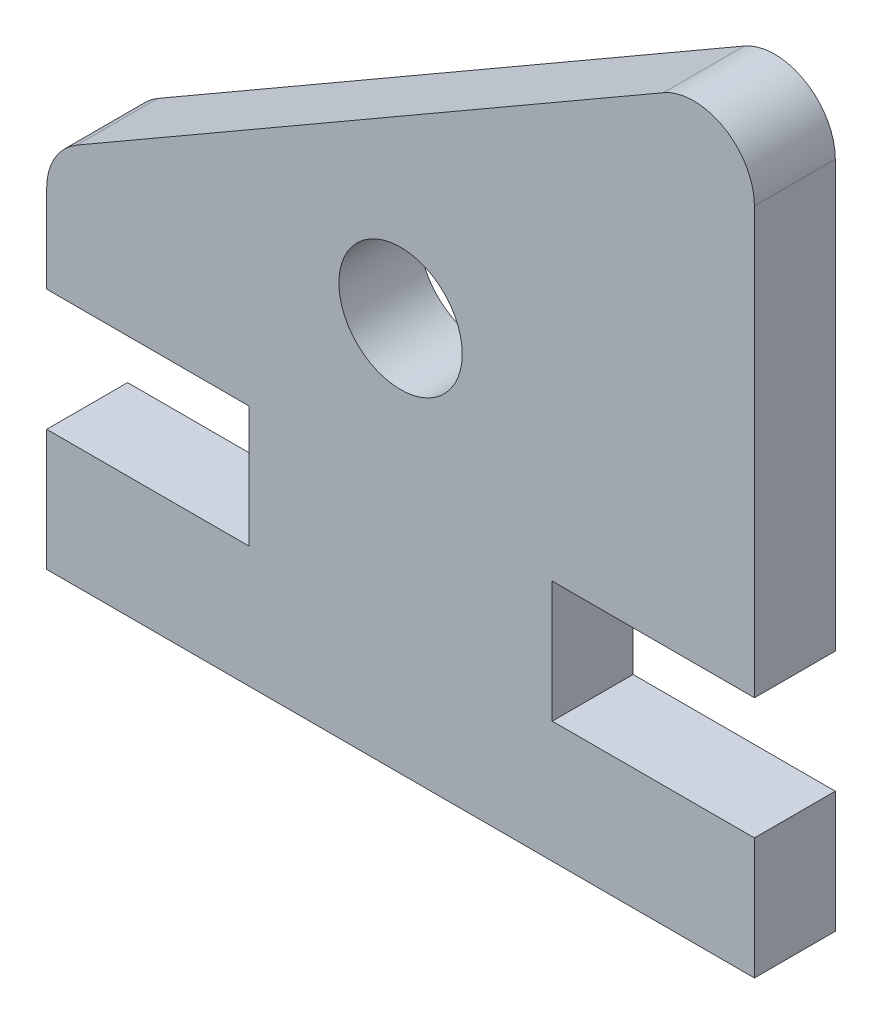
ISO-10303-21;
HEADER;
FILE_DESCRIPTION(('STEP AP214'),'2;1');
FILE_NAME('part.step','',(''),(''),'','','');
FILE_SCHEMA(('AUTOMOTIVE_DESIGN { 1 0 10303 214 1 1 1 1 }'));
ENDSEC;
DATA;
#1=APPLICATION_CONTEXT('core data for automotive mechanical design processes');
#2=APPLICATION_PROTOCOL_DEFINITION('international standard','automotive_design',2000,#1);
#3=PRODUCT_CONTEXT('',#1,'mechanical');
#4=PRODUCT('Part','Part','',(#3));
#5=PRODUCT_RELATED_PRODUCT_CATEGORY('part','',(#4));
#6=PRODUCT_DEFINITION_FORMATION('','',#4);
#7=PRODUCT_DEFINITION_CONTEXT('part definition',#1,'design');
#8=PRODUCT_DEFINITION('design','',#6,#7);
#9=PRODUCT_DEFINITION_SHAPE('','',#8);
#10=(LENGTH_UNIT() NAMED_UNIT(*) SI_UNIT(.MILLI.,.METRE.));
#11=(NAMED_UNIT(*) PLANE_ANGLE_UNIT() SI_UNIT($,.RADIAN.));
#12=(NAMED_UNIT(*) SI_UNIT($,.STERADIAN.) SOLID_ANGLE_UNIT());
#13=UNCERTAINTY_MEASURE_WITH_UNIT(LENGTH_MEASURE(1.E-05),#10,'distance_accuracy_value','');
#14=(GEOMETRIC_REPRESENTATION_CONTEXT(3) GLOBAL_UNCERTAINTY_ASSIGNED_CONTEXT((#13)) GLOBAL_UNIT_ASSIGNED_CONTEXT((#10,
#11,#12)) REPRESENTATION_CONTEXT('',''));
#15=CARTESIAN_POINT('',(0.,0.,0.));
#16=DIRECTION('',(0.,0.,1.));
#17=DIRECTION('',(1.,0.,0.));
#18=AXIS2_PLACEMENT_3D('',#15,#16,#17);
#19=CARTESIAN_POINT('',(0.,6.,4.));
#20=DIRECTION('',(0.,-1.,0.));
#21=DIRECTION('',(1.,0.,0.));
#22=AXIS2_PLACEMENT_3D('',#19,#20,#21);
#23=PLANE('',#22);
#24=DIRECTION('',(-1.,0.,0.));
#25=VECTOR('',#24,1.);
#26=CARTESIAN_POINT('',(0.,6.,0.));
#27=LINE('',#26,#25);
#28=CARTESIAN_POINT('',(0.,6.,0.));
#29=VERTEX_POINT('',#28);
#30=CARTESIAN_POINT('',(-10.,6.,0.));
#31=VERTEX_POINT('',#30);
#32=EDGE_CURVE('E161',#29,#31,#27,.T.);
#33=ORIENTED_EDGE('',*,*,#32,.T.);
#34=DIRECTION('',(0.,0.,-1.));
#35=VECTOR('',#34,1.);
#36=CARTESIAN_POINT('',(-10.,6.,4.));
#37=LINE('',#36,#35);
#38=CARTESIAN_POINT('',(-10.,6.,4.));
#39=VERTEX_POINT('',#38);
#40=EDGE_CURVE('E143',#39,#31,#37,.T.);
#41=ORIENTED_EDGE('',*,*,#40,.F.);
#42=DIRECTION('',(-1.,0.,0.));
#43=VECTOR('',#42,1.);
#44=CARTESIAN_POINT('',(0.,6.,4.));
#45=LINE('',#44,#43);
#46=CARTESIAN_POINT('',(0.,6.,4.));
#47=VERTEX_POINT('',#46);
#48=EDGE_CURVE('E149',#47,#39,#45,.T.);
#49=ORIENTED_EDGE('',*,*,#48,.F.);
#50=DIRECTION('',(0.,0.,-1.));
#51=VECTOR('',#50,1.);
#52=CARTESIAN_POINT('',(0.,6.,4.));
#53=LINE('',#52,#51);
#54=EDGE_CURVE('E228',#47,#29,#53,.T.);
#55=ORIENTED_EDGE('',*,*,#54,.T.);
#56=EDGE_LOOP('',(#33,#41,#49,#55));
#57=FACE_BOUND('',#56,.T.);
#58=ADVANCED_FACE('F37',(#57),#23,.F.);
#59=CARTESIAN_POINT('',(-10.,0.,4.));
#60=DIRECTION('',(-1.,0.,0.));
#61=DIRECTION('',(0.,0.,1.));
#62=AXIS2_PLACEMENT_3D('',#59,#60,#61);
#63=PLANE('',#62);
#64=DIRECTION('',(0.,1.,0.));
#65=VECTOR('',#64,1.);
#66=CARTESIAN_POINT('',(-10.,0.,0.));
#67=LINE('',#66,#65);
#68=CARTESIAN_POINT('',(-10.,12.,0.));
#69=VERTEX_POINT('',#68);
#70=EDGE_CURVE('E248',#31,#69,#67,.T.);
#71=ORIENTED_EDGE('',*,*,#70,.T.);
#72=DIRECTION('',(0.,0.,-1.));
#73=VECTOR('',#72,1.);
#74=CARTESIAN_POINT('',(-10.,12.,4.));
#75=LINE('',#74,#73);
#76=CARTESIAN_POINT('',(-10.,12.,4.));
#77=VERTEX_POINT('',#76);
#78=EDGE_CURVE('E145',#77,#69,#75,.T.);
#79=ORIENTED_EDGE('',*,*,#78,.F.);
#80=DIRECTION('',(0.,1.,0.));
#81=VECTOR('',#80,1.);
#82=CARTESIAN_POINT('',(-10.,0.,4.));
#83=LINE('',#82,#81);
#84=EDGE_CURVE('E138',#39,#77,#83,.T.);
#85=ORIENTED_EDGE('',*,*,#84,.F.);
#86=ORIENTED_EDGE('',*,*,#40,.T.);
#87=EDGE_LOOP('',(#71,#79,#85,#86));
#88=FACE_BOUND('',#87,.T.);
#89=ADVANCED_FACE('F141',(#88),#63,.F.);
#90=CARTESIAN_POINT('',(0.,12.,4.));
#91=DIRECTION('',(0.,-1.,0.));
#92=DIRECTION('',(0.,0.,-1.));
#93=AXIS2_PLACEMENT_3D('',#90,#91,#92);
#94=PLANE('',#93);
#95=DIRECTION('',(-1.,0.,0.));
#96=VECTOR('',#95,1.);
#97=CARTESIAN_POINT('',(0.,12.,0.));
#98=LINE('',#97,#96);
#99=CARTESIAN_POINT('',(0.,12.,0.));
#100=VERTEX_POINT('',#99);
#101=EDGE_CURVE('E213',#100,#69,#98,.T.);
#102=ORIENTED_EDGE('',*,*,#101,.F.);
#103=DIRECTION('',(0.,0.,-1.));
#104=VECTOR('',#103,1.);
#105=CARTESIAN_POINT('',(0.,12.,4.));
#106=LINE('',#105,#104);
#107=CARTESIAN_POINT('',(0.,12.,4.));
#108=VERTEX_POINT('',#107);
#109=EDGE_CURVE('E167',#108,#100,#106,.T.);
#110=ORIENTED_EDGE('',*,*,#109,.F.);
#111=DIRECTION('',(-1.,0.,0.));
#112=VECTOR('',#111,1.);
#113=CARTESIAN_POINT('',(0.,12.,4.));
#114=LINE('',#113,#112);
#115=EDGE_CURVE('E148',#108,#77,#114,.T.);
#116=ORIENTED_EDGE('',*,*,#115,.T.);
#117=ORIENTED_EDGE('',*,*,#78,.T.);
#118=EDGE_LOOP('',(#102,#110,#116,#117));
#119=FACE_BOUND('',#118,.T.);
#120=ADVANCED_FACE('F247',(#119),#94,.T.);
#121=CARTESIAN_POINT('',(0.,0.,4.));
#122=DIRECTION('',(1.,0.,0.));
#123=DIRECTION('',(0.,1.,0.));
#124=AXIS2_PLACEMENT_3D('',#121,#122,#123);
#125=PLANE('',#124);
#126=DIRECTION('',(0.,-1.,0.));
#127=VECTOR('',#126,1.);
#128=CARTESIAN_POINT('',(0.,0.,0.));
#129=LINE('',#128,#127);
#130=CARTESIAN_POINT('',(0.,33.0677313259561,0.));
#131=VERTEX_POINT('',#130);
#132=EDGE_CURVE('E208',#131,#100,#129,.T.);
#133=ORIENTED_EDGE('',*,*,#132,.F.);
#134=DIRECTION('',(0.,0.,-1.));
#135=VECTOR('',#134,1.);
#136=CARTESIAN_POINT('',(0.,33.0677313259561,4.));
#137=LINE('',#136,#135);
#138=CARTESIAN_POINT('',(0.,33.0677313259561,4.));
#139=VERTEX_POINT('',#138);
#140=EDGE_CURVE('E11',#131,#139,#137,.F.);
#141=ORIENTED_EDGE('',*,*,#140,.T.);
#142=DIRECTION('',(0.,-1.,0.));
#143=VECTOR('',#142,1.);
#144=CARTESIAN_POINT('',(0.,0.,4.));
#145=LINE('',#144,#143);
#146=EDGE_CURVE('E244',#139,#108,#145,.T.);
#147=ORIENTED_EDGE('',*,*,#146,.T.);
#148=ORIENTED_EDGE('',*,*,#109,.T.);
#149=EDGE_LOOP('',(#133,#141,#147,#148));
#150=FACE_BOUND('',#149,.T.);
#151=ADVANCED_FACE('F243',(#150),#125,.T.);
#152=CARTESIAN_POINT('',(-16.5687476868981,28.6979128114972,4.));
#153=DIRECTION('',(-0.499999999999995,0.866025403784441,0.));
#154=DIRECTION('',(-0.866025403784442,-0.499999999999995,0.));
#155=AXIS2_PLACEMENT_3D('',#152,#153,#154);
#156=PLANE('',#155);
#157=DIRECTION('',(0.866025403784442,0.499999999999995,0.));
#158=VECTOR('',#157,1.);
#159=CARTESIAN_POINT('',(-16.5687476868981,28.6979128114972,0.));
#160=LINE('',#159,#158);
#161=CARTESIAN_POINT('',(-33.5,18.9226497308105,0.));
#162=VERTEX_POINT('',#161);
#163=CARTESIAN_POINT('',(-4.49999999999999,35.6658075373094,0.));
#164=VERTEX_POINT('',#163);
#165=EDGE_CURVE('E202',#162,#164,#160,.T.);
#166=ORIENTED_EDGE('',*,*,#165,.F.);
#167=DIRECTION('',(0.,0.,-1.));
#168=VECTOR('',#167,1.);
#169=CARTESIAN_POINT('',(-33.5,18.9226497308105,4.));
#170=LINE('',#169,#168);
#171=CARTESIAN_POINT('',(-33.5,18.9226497308105,4.));
#172=VERTEX_POINT('',#171);
#173=EDGE_CURVE('E177',#162,#172,#170,.F.);
#174=ORIENTED_EDGE('',*,*,#173,.T.);
#175=DIRECTION('',(0.866025403784442,0.499999999999995,0.));
#176=VECTOR('',#175,1.);
#177=CARTESIAN_POINT('',(-16.5687476868981,28.6979128114972,4.));
#178=LINE('',#177,#176);
#179=CARTESIAN_POINT('',(-4.49999999999999,35.6658075373094,4.));
#180=VERTEX_POINT('',#179);
#181=EDGE_CURVE('E185',#172,#180,#178,.T.);
#182=ORIENTED_EDGE('',*,*,#181,.T.);
#183=DIRECTION('',(0.,0.,-1.));
#184=VECTOR('',#183,1.);
#185=CARTESIAN_POINT('',(-4.49999999999999,35.6658075373094,4.));
#186=LINE('',#185,#184);
#187=EDGE_CURVE('E174',#180,#164,#186,.T.);
#188=ORIENTED_EDGE('',*,*,#187,.T.);
#189=EDGE_LOOP('',(#166,#174,#182,#188));
#190=FACE_BOUND('',#189,.T.);
#191=ADVANCED_FACE('F206',(#190),#156,.T.);
#192=CARTESIAN_POINT('',(-35.,0.,4.));
#193=DIRECTION('',(-1.,0.,0.));
#194=DIRECTION('',(0.,0.,1.));
#195=AXIS2_PLACEMENT_3D('',#192,#193,#194);
#196=PLANE('',#195);
#197=DIRECTION('',(0.,1.,0.));
#198=VECTOR('',#197,1.);
#199=CARTESIAN_POINT('',(-35.,0.,4.));
#200=LINE('',#199,#198);
#201=CARTESIAN_POINT('',(-35.,12.,4.));
#202=VERTEX_POINT('',#201);
#203=CARTESIAN_POINT('',(-35.,16.3245735194572,4.));
#204=VERTEX_POINT('',#203);
#205=EDGE_CURVE('E183',#202,#204,#200,.T.);
#206=ORIENTED_EDGE('',*,*,#205,.T.);
#207=DIRECTION('',(0.,0.,-1.));
#208=VECTOR('',#207,1.);
#209=CARTESIAN_POINT('',(-35.,16.3245735194572,4.));
#210=LINE('',#209,#208);
#211=CARTESIAN_POINT('',(-35.,16.3245735194572,0.));
#212=VERTEX_POINT('',#211);
#213=EDGE_CURVE('E162',#204,#212,#210,.T.);
#214=ORIENTED_EDGE('',*,*,#213,.T.);
#215=DIRECTION('',(0.,1.,0.));
#216=VECTOR('',#215,1.);
#217=CARTESIAN_POINT('',(-35.,0.,0.));
#218=LINE('',#217,#216);
#219=CARTESIAN_POINT('',(-35.,12.,0.));
#220=VERTEX_POINT('',#219);
#221=EDGE_CURVE('E204',#220,#212,#218,.T.);
#222=ORIENTED_EDGE('',*,*,#221,.F.);
#223=DIRECTION('',(0.,0.,-1.));
#224=VECTOR('',#223,1.);
#225=CARTESIAN_POINT('',(-35.,12.,4.));
#226=LINE('',#225,#224);
#227=EDGE_CURVE('E193',#202,#220,#226,.T.);
#228=ORIENTED_EDGE('',*,*,#227,.F.);
#229=EDGE_LOOP('',(#206,#214,#222,#228));
#230=FACE_BOUND('',#229,.T.);
#231=ADVANCED_FACE('F190',(#230),#196,.T.);
#232=CARTESIAN_POINT('',(0.,12.,4.));
#233=DIRECTION('',(0.,-1.,0.));
#234=DIRECTION('',(0.,0.,-1.));
#235=AXIS2_PLACEMENT_3D('',#232,#233,#234);
#236=PLANE('',#235);
#237=DIRECTION('',(-1.,0.,0.));
#238=VECTOR('',#237,1.);
#239=CARTESIAN_POINT('',(0.,12.,0.));
#240=LINE('',#239,#238);
#241=CARTESIAN_POINT('',(-25.,12.,0.));
#242=VERTEX_POINT('',#241);
#243=EDGE_CURVE('E210',#242,#220,#240,.T.);
#244=ORIENTED_EDGE('',*,*,#243,.F.);
#245=DIRECTION('',(0.,0.,-1.));
#246=VECTOR('',#245,1.);
#247=CARTESIAN_POINT('',(-25.,12.,4.));
#248=LINE('',#247,#246);
#249=CARTESIAN_POINT('',(-25.,12.,4.));
#250=VERTEX_POINT('',#249);
#251=EDGE_CURVE('E238',#250,#242,#248,.T.);
#252=ORIENTED_EDGE('',*,*,#251,.F.);
#253=DIRECTION('',(-1.,0.,0.));
#254=VECTOR('',#253,1.);
#255=CARTESIAN_POINT('',(0.,12.,4.));
#256=LINE('',#255,#254);
#257=EDGE_CURVE('E194',#250,#202,#256,.T.);
#258=ORIENTED_EDGE('',*,*,#257,.T.);
#259=ORIENTED_EDGE('',*,*,#227,.T.);
#260=EDGE_LOOP('',(#244,#252,#258,#259));
#261=FACE_BOUND('',#260,.T.);
#262=ADVANCED_FACE('F293',(#261),#236,.T.);
#263=CARTESIAN_POINT('',(-25.,0.,4.));
#264=DIRECTION('',(-1.,0.,0.));
#265=DIRECTION('',(0.,0.,1.));
#266=AXIS2_PLACEMENT_3D('',#263,#264,#265);
#267=PLANE('',#266);
#268=DIRECTION('',(0.,1.,0.));
#269=VECTOR('',#268,1.);
#270=CARTESIAN_POINT('',(-25.,0.,0.));
#271=LINE('',#270,#269);
#272=CARTESIAN_POINT('',(-25.,6.,0.));
#273=VERTEX_POINT('',#272);
#274=EDGE_CURVE('E219',#273,#242,#271,.T.);
#275=ORIENTED_EDGE('',*,*,#274,.F.);
#276=DIRECTION('',(0.,0.,-1.));
#277=VECTOR('',#276,1.);
#278=CARTESIAN_POINT('',(-25.,6.,4.));
#279=LINE('',#278,#277);
#280=CARTESIAN_POINT('',(-25.,6.,4.));
#281=VERTEX_POINT('',#280);
#282=EDGE_CURVE('E236',#281,#273,#279,.T.);
#283=ORIENTED_EDGE('',*,*,#282,.F.);
#284=DIRECTION('',(0.,1.,0.));
#285=VECTOR('',#284,1.);
#286=CARTESIAN_POINT('',(-25.,0.,4.));
#287=LINE('',#286,#285);
#288=EDGE_CURVE('E260',#281,#250,#287,.T.);
#289=ORIENTED_EDGE('',*,*,#288,.T.);
#290=ORIENTED_EDGE('',*,*,#251,.T.);
#291=EDGE_LOOP('',(#275,#283,#289,#290));
#292=FACE_BOUND('',#291,.T.);
#293=ADVANCED_FACE('F288',(#292),#267,.T.);
#294=CARTESIAN_POINT('',(0.,6.00000000000001,4.));
#295=DIRECTION('',(0.,-1.,0.));
#296=DIRECTION('',(1.,0.,0.));
#297=AXIS2_PLACEMENT_3D('',#294,#295,#296);
#298=PLANE('',#297);
#299=DIRECTION('',(-1.,0.,0.));
#300=VECTOR('',#299,1.);
#301=CARTESIAN_POINT('',(0.,6.00000000000001,0.));
#302=LINE('',#301,#300);
#303=CARTESIAN_POINT('',(-35.,6.,0.));
#304=VERTEX_POINT('',#303);
#305=EDGE_CURVE('E222',#273,#304,#302,.T.);
#306=ORIENTED_EDGE('',*,*,#305,.T.);
#307=DIRECTION('',(0.,0.,-1.));
#308=VECTOR('',#307,1.);
#309=CARTESIAN_POINT('',(-35.,6.,4.));
#310=LINE('',#309,#308);
#311=CARTESIAN_POINT('',(-35.,6.,4.));
#312=VERTEX_POINT('',#311);
#313=EDGE_CURVE('E234',#312,#304,#310,.T.);
#314=ORIENTED_EDGE('',*,*,#313,.F.);
#315=DIRECTION('',(-1.,0.,0.));
#316=VECTOR('',#315,1.);
#317=CARTESIAN_POINT('',(0.,6.00000000000001,4.));
#318=LINE('',#317,#316);
#319=EDGE_CURVE('E258',#281,#312,#318,.T.);
#320=ORIENTED_EDGE('',*,*,#319,.F.);
#321=ORIENTED_EDGE('',*,*,#282,.T.);
#322=EDGE_LOOP('',(#306,#314,#320,#321));
#323=FACE_BOUND('',#322,.T.);
#324=ADVANCED_FACE('F294',(#323),#298,.F.);
#325=CARTESIAN_POINT('',(-35.,0.,0.));
#326=VERTEX_POINT('',#325);
#327=EDGE_CURVE('E212',#326,#304,#218,.T.);
#328=ORIENTED_EDGE('',*,*,#327,.F.);
#329=DIRECTION('',(0.,0.,-1.));
#330=VECTOR('',#329,1.);
#331=CARTESIAN_POINT('',(-35.,0.,4.));
#332=LINE('',#331,#330);
#333=CARTESIAN_POINT('',(-35.,0.,4.));
#334=VERTEX_POINT('',#333);
#335=EDGE_CURVE('E232',#334,#326,#332,.T.);
#336=ORIENTED_EDGE('',*,*,#335,.F.);
#337=EDGE_CURVE('E196',#334,#312,#200,.T.);
#338=ORIENTED_EDGE('',*,*,#337,.T.);
#339=ORIENTED_EDGE('',*,*,#313,.T.);
#340=EDGE_LOOP('',(#328,#336,#338,#339));
#341=FACE_BOUND('',#340,.T.);
#342=ADVANCED_FACE('F282',(#341),#196,.T.);
#343=CARTESIAN_POINT('',(0.,0.,4.));
#344=DIRECTION('',(0.,-1.,0.));
#345=DIRECTION('',(1.,0.,0.));
#346=AXIS2_PLACEMENT_3D('',#343,#344,#345);
#347=PLANE('',#346);
#348=DIRECTION('',(-1.,0.,0.));
#349=VECTOR('',#348,1.);
#350=CARTESIAN_POINT('',(0.,0.,0.));
#351=LINE('',#350,#349);
#352=CARTESIAN_POINT('',(0.,0.,0.));
#353=VERTEX_POINT('',#352);
#354=EDGE_CURVE('E225',#353,#326,#351,.T.);
#355=ORIENTED_EDGE('',*,*,#354,.F.);
#356=DIRECTION('',(0.,0.,-1.));
#357=VECTOR('',#356,1.);
#358=CARTESIAN_POINT('',(0.,0.,4.));
#359=LINE('',#358,#357);
#360=CARTESIAN_POINT('',(0.,0.,4.));
#361=VERTEX_POINT('',#360);
#362=EDGE_CURVE('E230',#361,#353,#359,.T.);
#363=ORIENTED_EDGE('',*,*,#362,.F.);
#364=DIRECTION('',(-1.,0.,0.));
#365=VECTOR('',#364,1.);
#366=CARTESIAN_POINT('',(0.,0.,4.));
#367=LINE('',#366,#365);
#368=EDGE_CURVE('E255',#361,#334,#367,.T.);
#369=ORIENTED_EDGE('',*,*,#368,.T.);
#370=ORIENTED_EDGE('',*,*,#335,.T.);
#371=EDGE_LOOP('',(#355,#363,#369,#370));
#372=FACE_BOUND('',#371,.T.);
#373=ADVANCED_FACE('F277',(#372),#347,.T.);
#374=CARTESIAN_POINT('',(-17.5,19.5,4.));
#375=DIRECTION('',(0.,0.,-1.));
#376=DIRECTION('',(-1.,0.,0.));
#377=AXIS2_PLACEMENT_3D('',#374,#375,#376);
#378=CYLINDRICAL_SURFACE('',#377,3.04999999999999);
#379=CARTESIAN_POINT('',(-17.5,19.5,4.));
#380=DIRECTION('',(0.,0.,1.));
#381=DIRECTION('',(1.,0.,0.));
#382=AXIS2_PLACEMENT_3D('',#379,#380,#381);
#383=CIRCLE('',#382,3.04999999999999);
#384=CARTESIAN_POINT('',(-14.45,19.5,4.));
#385=VERTEX_POINT('',#384);
#386=EDGE_CURVE('E158',#385,#385,#383,.T.);
#387=ORIENTED_EDGE('',*,*,#386,.T.);
#388=EDGE_LOOP('',(#387));
#389=FACE_BOUND('',#388,.T.);
#390=CARTESIAN_POINT('',(-17.5,19.5,0.));
#391=DIRECTION('',(0.,0.,1.));
#392=DIRECTION('',(1.,0.,0.));
#393=AXIS2_PLACEMENT_3D('',#390,#391,#392);
#394=CIRCLE('',#393,3.04999999999999);
#395=CARTESIAN_POINT('',(-14.45,19.5,0.));
#396=VERTEX_POINT('',#395);
#397=EDGE_CURVE('E252',#396,#396,#394,.T.);
#398=ORIENTED_EDGE('',*,*,#397,.F.);
#399=EDGE_LOOP('',(#398));
#400=FACE_BOUND('',#399,.T.);
#401=ADVANCED_FACE('F311',(#389,#400),#378,.F.);
#402=EDGE_CURVE('E215',#29,#353,#129,.T.);
#403=ORIENTED_EDGE('',*,*,#402,.F.);
#404=ORIENTED_EDGE('',*,*,#54,.F.);
#405=EDGE_CURVE('E156',#47,#361,#145,.T.);
#406=ORIENTED_EDGE('',*,*,#405,.T.);
#407=ORIENTED_EDGE('',*,*,#362,.T.);
#408=EDGE_LOOP('',(#403,#404,#406,#407));
#409=FACE_BOUND('',#408,.T.);
#410=ADVANCED_FACE('F275',(#409),#125,.T.);
#411=CARTESIAN_POINT('',(0.,0.,4.));
#412=DIRECTION('',(0.,0.,1.));
#413=DIRECTION('',(1.,0.,0.));
#414=AXIS2_PLACEMENT_3D('',#411,#412,#413);
#415=PLANE('',#414);
#416=ORIENTED_EDGE('',*,*,#386,.F.);
#417=EDGE_LOOP('',(#416));
#418=FACE_BOUND('',#417,.T.);
#419=ORIENTED_EDGE('',*,*,#181,.F.);
#420=CARTESIAN_POINT('',(-32.,16.3245735194572,4.));
#421=DIRECTION('',(0.,0.,1.));
#422=DIRECTION('',(1.,0.,0.));
#423=AXIS2_PLACEMENT_3D('',#420,#421,#422);
#424=CIRCLE('',#423,3.);
#425=EDGE_CURVE('E45',#172,#204,#424,.T.);
#426=ORIENTED_EDGE('',*,*,#425,.T.);
#427=ORIENTED_EDGE('',*,*,#205,.F.);
#428=ORIENTED_EDGE('',*,*,#257,.F.);
#429=ORIENTED_EDGE('',*,*,#288,.F.);
#430=ORIENTED_EDGE('',*,*,#319,.T.);
#431=ORIENTED_EDGE('',*,*,#337,.F.);
#432=ORIENTED_EDGE('',*,*,#368,.F.);
#433=ORIENTED_EDGE('',*,*,#405,.F.);
#434=ORIENTED_EDGE('',*,*,#48,.T.);
#435=ORIENTED_EDGE('',*,*,#84,.T.);
#436=ORIENTED_EDGE('',*,*,#115,.F.);
#437=ORIENTED_EDGE('',*,*,#146,.F.);
#438=CARTESIAN_POINT('',(-3.00000000000001,33.0677313259561,4.));
#439=DIRECTION('',(0.,0.,1.));
#440=DIRECTION('',(1.,0.,0.));
#441=AXIS2_PLACEMENT_3D('',#438,#439,#440);
#442=CIRCLE('',#441,3.);
#443=EDGE_CURVE('E57',#139,#180,#442,.T.);
#444=ORIENTED_EDGE('',*,*,#443,.T.);
#445=EDGE_LOOP('',(#419,#426,#427,#428,#429,#430,#431,#432,#433,#434,#435,#436,#437,#444));
#446=FACE_BOUND('',#445,.T.);
#447=ADVANCED_FACE('F153',(#418,#446),#415,.T.);
#448=CARTESIAN_POINT('',(0.,0.,0.));
#449=DIRECTION('',(0.,0.,1.));
#450=DIRECTION('',(1.,0.,0.));
#451=AXIS2_PLACEMENT_3D('',#448,#449,#450);
#452=PLANE('',#451);
#453=ORIENTED_EDGE('',*,*,#397,.T.);
#454=EDGE_LOOP('',(#453));
#455=FACE_BOUND('',#454,.T.);
#456=ORIENTED_EDGE('',*,*,#221,.T.);
#457=CARTESIAN_POINT('',(-32.,16.3245735194572,0.));
#458=DIRECTION('',(0.,0.,1.));
#459=DIRECTION('',(1.,0.,0.));
#460=AXIS2_PLACEMENT_3D('',#457,#458,#459);
#461=CIRCLE('',#460,3.);
#462=EDGE_CURVE('E172',#212,#162,#461,.F.);
#463=ORIENTED_EDGE('',*,*,#462,.T.);
#464=ORIENTED_EDGE('',*,*,#165,.T.);
#465=CARTESIAN_POINT('',(-3.00000000000001,33.0677313259561,0.));
#466=DIRECTION('',(0.,0.,1.));
#467=DIRECTION('',(1.,0.,0.));
#468=AXIS2_PLACEMENT_3D('',#465,#466,#467);
#469=CIRCLE('',#468,3.);
#470=EDGE_CURVE('E165',#164,#131,#469,.F.);
#471=ORIENTED_EDGE('',*,*,#470,.T.);
#472=ORIENTED_EDGE('',*,*,#132,.T.);
#473=ORIENTED_EDGE('',*,*,#101,.T.);
#474=ORIENTED_EDGE('',*,*,#70,.F.);
#475=ORIENTED_EDGE('',*,*,#32,.F.);
#476=ORIENTED_EDGE('',*,*,#402,.T.);
#477=ORIENTED_EDGE('',*,*,#354,.T.);
#478=ORIENTED_EDGE('',*,*,#327,.T.);
#479=ORIENTED_EDGE('',*,*,#305,.F.);
#480=ORIENTED_EDGE('',*,*,#274,.T.);
#481=ORIENTED_EDGE('',*,*,#243,.T.);
#482=EDGE_LOOP('',(#456,#463,#464,#471,#472,#473,#474,#475,#476,#477,#478,#479,#480,#481));
#483=FACE_BOUND('',#482,.T.);
#484=ADVANCED_FACE('F201',(#455,#483),#452,.F.);
#485=CARTESIAN_POINT('',(-32.,16.3245735194572,4.));
#486=DIRECTION('',(0.,0.,-1.));
#487=DIRECTION('',(-1.,0.,0.));
#488=AXIS2_PLACEMENT_3D('',#485,#486,#487);
#489=CYLINDRICAL_SURFACE('',#488,3.);
#490=ORIENTED_EDGE('',*,*,#425,.F.);
#491=ORIENTED_EDGE('',*,*,#173,.F.);
#492=ORIENTED_EDGE('',*,*,#462,.F.);
#493=ORIENTED_EDGE('',*,*,#213,.F.);
#494=EDGE_LOOP('',(#490,#491,#492,#493));
#495=FACE_BOUND('',#494,.T.);
#496=ADVANCED_FACE('F197',(#495),#489,.T.);
#497=CARTESIAN_POINT('',(-3.00000000000001,33.0677313259561,4.));
#498=DIRECTION('',(0.,0.,-1.));
#499=DIRECTION('',(-1.,0.,0.));
#500=AXIS2_PLACEMENT_3D('',#497,#498,#499);
#501=CYLINDRICAL_SURFACE('',#500,3.);
#502=ORIENTED_EDGE('',*,*,#443,.F.);
#503=ORIENTED_EDGE('',*,*,#140,.F.);
#504=ORIENTED_EDGE('',*,*,#470,.F.);
#505=ORIENTED_EDGE('',*,*,#187,.F.);
#506=EDGE_LOOP('',(#502,#503,#504,#505));
#507=FACE_BOUND('',#506,.T.);
#508=ADVANCED_FACE('F39',(#507),#501,.T.);
#509=CLOSED_SHELL('',(#58,#89,#120,#151,#191,#231,#262,#293,#324,#342,#373,#401,#410,#447,#484,
#496,#508));
#510=MANIFOLD_SOLID_BREP('B2',#509);
#511=ADVANCED_BREP_SHAPE_REPRESENTATION('',(#18,#510),#14);
#512=SHAPE_DEFINITION_REPRESENTATION(#9,#511);
ENDSEC;
END-ISO-10303-21;
